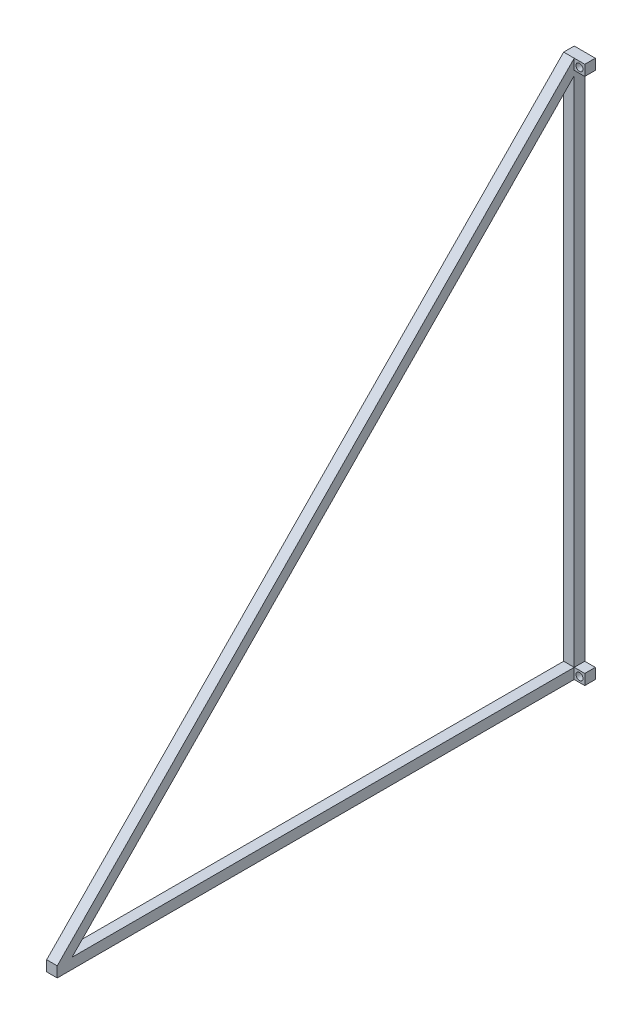
ISO-10303-21;
HEADER;
FILE_DESCRIPTION(('STEP AP214'),'2;1');
FILE_NAME('part.step','',(''),(''),'','','');
FILE_SCHEMA(('AUTOMOTIVE_DESIGN { 1 0 10303 214 1 1 1 1 }'));
ENDSEC;
DATA;
#1=APPLICATION_CONTEXT('core data for automotive mechanical design processes');
#2=APPLICATION_PROTOCOL_DEFINITION('international standard','automotive_design',2000,#1);
#3=PRODUCT_CONTEXT('',#1,'mechanical');
#4=PRODUCT('Part','Part','',(#3));
#5=PRODUCT_RELATED_PRODUCT_CATEGORY('part','',(#4));
#6=PRODUCT_DEFINITION_FORMATION('','',#4);
#7=PRODUCT_DEFINITION_CONTEXT('part definition',#1,'design');
#8=PRODUCT_DEFINITION('design','',#6,#7);
#9=PRODUCT_DEFINITION_SHAPE('','',#8);
#10=(LENGTH_UNIT() NAMED_UNIT(*) SI_UNIT(.MILLI.,.METRE.));
#11=(NAMED_UNIT(*) PLANE_ANGLE_UNIT() SI_UNIT($,.RADIAN.));
#12=(NAMED_UNIT(*) SI_UNIT($,.STERADIAN.) SOLID_ANGLE_UNIT());
#13=UNCERTAINTY_MEASURE_WITH_UNIT(LENGTH_MEASURE(1.E-05),#10,'distance_accuracy_value','');
#14=(GEOMETRIC_REPRESENTATION_CONTEXT(3) GLOBAL_UNCERTAINTY_ASSIGNED_CONTEXT((#13)) GLOBAL_UNIT_ASSIGNED_CONTEXT((#10,
#11,#12)) REPRESENTATION_CONTEXT('',''));
#15=CARTESIAN_POINT('',(0.,0.,0.));
#16=DIRECTION('',(0.,0.,1.));
#17=DIRECTION('',(1.,0.,0.));
#18=AXIS2_PLACEMENT_3D('',#15,#16,#17);
#19=CARTESIAN_POINT('',(0.,0.,3.));
#20=DIRECTION('',(0.,0.,1.));
#21=DIRECTION('',(1.,0.,0.));
#22=AXIS2_PLACEMENT_3D('',#19,#20,#21);
#23=PLANE('',#22);
#24=CARTESIAN_POINT('',(4.49999999999948,151.5,3.));
#25=DIRECTION('',(0.,0.,1.));
#26=DIRECTION('',(1.,0.,0.));
#27=AXIS2_PLACEMENT_3D('',#24,#25,#26);
#28=CIRCLE('',#27,0.999999999999999);
#29=CARTESIAN_POINT('',(5.49999999999948,151.5,3.));
#30=VERTEX_POINT('',#29);
#31=EDGE_CURVE('E200',#30,#30,#28,.T.);
#32=ORIENTED_EDGE('',*,*,#31,.F.);
#33=EDGE_LOOP('',(#32));
#34=FACE_BOUND('',#33,.T.);
#35=DIRECTION('',(1.,0.,0.));
#36=VECTOR('',#35,1.);
#37=CARTESIAN_POINT('',(0.,153.,3.));
#38=LINE('',#37,#36);
#39=CARTESIAN_POINT('',(3.,153.,3.));
#40=VERTEX_POINT('',#39);
#41=CARTESIAN_POINT('',(5.99999999999948,153.,3.));
#42=VERTEX_POINT('',#41);
#43=EDGE_CURVE('E66',#40,#42,#38,.T.);
#44=ORIENTED_EDGE('',*,*,#43,.F.);
#45=DIRECTION('',(0.,-1.,0.));
#46=VECTOR('',#45,1.);
#47=CARTESIAN_POINT('',(3.,0.,3.));
#48=LINE('',#47,#46);
#49=CARTESIAN_POINT('',(3.,150.,3.));
#50=VERTEX_POINT('',#49);
#51=EDGE_CURVE('E11',#40,#50,#48,.T.);
#52=ORIENTED_EDGE('',*,*,#51,.T.);
#53=DIRECTION('',(1.,0.,0.));
#54=VECTOR('',#53,1.);
#55=CARTESIAN_POINT('',(0.,150.,3.));
#56=LINE('',#55,#54);
#57=CARTESIAN_POINT('',(5.99999999999948,150.,3.));
#58=VERTEX_POINT('',#57);
#59=EDGE_CURVE('E149',#50,#58,#56,.T.);
#60=ORIENTED_EDGE('',*,*,#59,.T.);
#61=DIRECTION('',(0.,1.,0.));
#62=VECTOR('',#61,1.);
#63=CARTESIAN_POINT('',(5.99999999999948,0.,3.));
#64=LINE('',#63,#62);
#65=EDGE_CURVE('E156',#58,#42,#64,.T.);
#66=ORIENTED_EDGE('',*,*,#65,.T.);
#67=EDGE_LOOP('',(#44,#52,#60,#66));
#68=FACE_BOUND('',#67,.T.);
#69=ADVANCED_FACE('F41',(#34,#68),#23,.T.);
#70=DIRECTION('',(-1.,0.,0.));
#71=VECTOR('',#70,1.);
#72=CARTESIAN_POINT('',(3.,148.713848418811,2.99999999999999));
#73=LINE('',#72,#71);
#74=CARTESIAN_POINT('',(3.,148.713848418811,2.99999999999999));
#75=VERTEX_POINT('',#74);
#76=CARTESIAN_POINT('',(0.,148.713848418811,2.99999999999999));
#77=VERTEX_POINT('',#76);
#78=EDGE_CURVE('E270',#75,#77,#73,.T.);
#79=ORIENTED_EDGE('',*,*,#78,.T.);
#80=DIRECTION('',(0.,1.,0.));
#81=VECTOR('',#80,1.);
#82=CARTESIAN_POINT('',(0.,0.,3.));
#83=LINE('',#82,#81);
#84=CARTESIAN_POINT('',(0.,3.,3.));
#85=VERTEX_POINT('',#84);
#86=EDGE_CURVE('E291',#85,#77,#83,.T.);
#87=ORIENTED_EDGE('',*,*,#86,.F.);
#88=DIRECTION('',(-1.,0.,0.));
#89=VECTOR('',#88,1.);
#90=CARTESIAN_POINT('',(3.,3.,3.));
#91=LINE('',#90,#89);
#92=CARTESIAN_POINT('',(3.,3.,3.));
#93=VERTEX_POINT('',#92);
#94=EDGE_CURVE('E290',#93,#85,#91,.T.);
#95=ORIENTED_EDGE('',*,*,#94,.F.);
#96=DIRECTION('',(0.,1.,0.));
#97=VECTOR('',#96,1.);
#98=CARTESIAN_POINT('',(3.,0.,3.));
#99=LINE('',#98,#97);
#100=EDGE_CURVE('E145',#93,#75,#99,.T.);
#101=ORIENTED_EDGE('',*,*,#100,.T.);
#102=EDGE_LOOP('',(#79,#87,#95,#101));
#103=FACE_BOUND('',#102,.T.);
#104=ADVANCED_FACE('F289',(#103),#23,.T.);
#105=CARTESIAN_POINT('',(4.5,1.5,3.));
#106=DIRECTION('',(0.,0.,1.));
#107=DIRECTION('',(1.,0.,0.));
#108=AXIS2_PLACEMENT_3D('',#105,#106,#107);
#109=CIRCLE('',#108,1.);
#110=CARTESIAN_POINT('',(5.5,1.5,3.));
#111=VERTEX_POINT('',#110);
#112=EDGE_CURVE('E159',#111,#111,#109,.T.);
#113=ORIENTED_EDGE('',*,*,#112,.F.);
#114=EDGE_LOOP('',(#113));
#115=FACE_BOUND('',#114,.T.);
#116=DIRECTION('',(1.,0.,0.));
#117=VECTOR('',#116,1.);
#118=CARTESIAN_POINT('',(0.,3.,3.));
#119=LINE('',#118,#117);
#120=CARTESIAN_POINT('',(6.,3.,3.));
#121=VERTEX_POINT('',#120);
#122=EDGE_CURVE('E122',#93,#121,#119,.T.);
#123=ORIENTED_EDGE('',*,*,#122,.F.);
#124=DIRECTION('',(0.,1.,0.));
#125=VECTOR('',#124,1.);
#126=CARTESIAN_POINT('',(3.,0.,3.));
#127=LINE('',#126,#125);
#128=CARTESIAN_POINT('',(3.,0.,3.));
#129=VERTEX_POINT('',#128);
#130=EDGE_CURVE('E330',#129,#93,#127,.T.);
#131=ORIENTED_EDGE('',*,*,#130,.F.);
#132=DIRECTION('',(1.,0.,0.));
#133=VECTOR('',#132,1.);
#134=CARTESIAN_POINT('',(0.,0.,3.));
#135=LINE('',#134,#133);
#136=CARTESIAN_POINT('',(6.,0.,3.));
#137=VERTEX_POINT('',#136);
#138=EDGE_CURVE('E124',#129,#137,#135,.T.);
#139=ORIENTED_EDGE('',*,*,#138,.T.);
#140=DIRECTION('',(0.,1.,0.));
#141=VECTOR('',#140,1.);
#142=CARTESIAN_POINT('',(6.,0.,3.));
#143=LINE('',#142,#141);
#144=EDGE_CURVE('E116',#137,#121,#143,.T.);
#145=ORIENTED_EDGE('',*,*,#144,.T.);
#146=EDGE_LOOP('',(#123,#131,#139,#145));
#147=FACE_BOUND('',#146,.T.);
#148=ADVANCED_FACE('F118',(#115,#147),#23,.T.);
#149=CARTESIAN_POINT('',(0.,153.,3.));
#150=DIRECTION('',(0.,1.,0.));
#151=DIRECTION('',(0.,0.,1.));
#152=AXIS2_PLACEMENT_3D('',#149,#150,#151);
#153=PLANE('',#152);
#154=DIRECTION('',(1.,0.,0.));
#155=VECTOR('',#154,1.);
#156=CARTESIAN_POINT('',(0.,153.,0.));
#157=LINE('',#156,#155);
#158=CARTESIAN_POINT('',(0.,153.,0.));
#159=VERTEX_POINT('',#158);
#160=CARTESIAN_POINT('',(5.99999999999948,153.,0.));
#161=VERTEX_POINT('',#160);
#162=EDGE_CURVE('E167',#159,#161,#157,.T.);
#163=ORIENTED_EDGE('',*,*,#162,.F.);
#164=DIRECTION('',(0.,0.,-1.));
#165=VECTOR('',#164,1.);
#166=CARTESIAN_POINT('',(0.,153.,3.));
#167=LINE('',#166,#165);
#168=CARTESIAN_POINT('',(0.,153.,3.));
#169=VERTEX_POINT('',#168);
#170=EDGE_CURVE('E50',#169,#159,#167,.T.);
#171=ORIENTED_EDGE('',*,*,#170,.F.);
#172=EDGE_CURVE('E106',#169,#40,#38,.T.);
#173=ORIENTED_EDGE('',*,*,#172,.T.);
#174=ORIENTED_EDGE('',*,*,#43,.T.);
#175=DIRECTION('',(0.,0.,-1.));
#176=VECTOR('',#175,1.);
#177=CARTESIAN_POINT('',(5.99999999999948,153.,3.));
#178=LINE('',#177,#176);
#179=EDGE_CURVE('E98',#42,#161,#178,.T.);
#180=ORIENTED_EDGE('',*,*,#179,.T.);
#181=EDGE_LOOP('',(#163,#171,#173,#174,#180));
#182=FACE_BOUND('',#181,.T.);
#183=ADVANCED_FACE('F225',(#182),#153,.T.);
#184=CARTESIAN_POINT('',(0.,0.,3.));
#185=DIRECTION('',(-1.,0.,0.));
#186=DIRECTION('',(0.,-1.,0.));
#187=AXIS2_PLACEMENT_3D('',#184,#185,#186);
#188=PLANE('',#187);
#189=DIRECTION('',(0.,-0.714212839142507,0.699928582359657));
#190=VECTOR('',#189,1.);
#191=CARTESIAN_POINT('',(0.,76.4543970618241,78.0146908794124));
#192=LINE('',#191,#190);
#193=CARTESIAN_POINT('',(0.,2.99999999999999,150.));
#194=VERTEX_POINT('',#193);
#195=EDGE_CURVE('E224',#169,#194,#192,.T.);
#196=ORIENTED_EDGE('',*,*,#195,.F.);
#197=ORIENTED_EDGE('',*,*,#170,.T.);
#198=DIRECTION('',(0.,1.,0.));
#199=VECTOR('',#198,1.);
#200=CARTESIAN_POINT('',(0.,0.,0.));
#201=LINE('',#200,#199);
#202=CARTESIAN_POINT('',(0.,0.,0.));
#203=VERTEX_POINT('',#202);
#204=EDGE_CURVE('E172',#203,#159,#201,.T.);
#205=ORIENTED_EDGE('',*,*,#204,.F.);
#206=DIRECTION('',(0.,0.,-1.));
#207=VECTOR('',#206,1.);
#208=CARTESIAN_POINT('',(0.,0.,3.));
#209=LINE('',#208,#207);
#210=CARTESIAN_POINT('',(0.,0.,150.));
#211=VERTEX_POINT('',#210);
#212=EDGE_CURVE('E215',#211,#203,#209,.T.);
#213=ORIENTED_EDGE('',*,*,#212,.F.);
#214=DIRECTION('',(0.,1.,0.));
#215=VECTOR('',#214,1.);
#216=CARTESIAN_POINT('',(0.,1.38777878078145E-12,150.));
#217=LINE('',#216,#215);
#218=EDGE_CURVE('E239',#211,#194,#217,.T.);
#219=ORIENTED_EDGE('',*,*,#218,.T.);
#220=EDGE_LOOP('',(#196,#197,#205,#213,#219));
#221=FACE_BOUND('',#220,.T.);
#222=ORIENTED_EDGE('',*,*,#86,.T.);
#223=DIRECTION('',(0.,-0.714212839142507,0.699928582359657));
#224=VECTOR('',#223,1.);
#225=CARTESIAN_POINT('',(0.,74.3546113147451,75.8720523619849));
#226=LINE('',#225,#224);
#227=CARTESIAN_POINT('',(0.,3.,145.799571450435));
#228=VERTEX_POINT('',#227);
#229=EDGE_CURVE('E274',#77,#228,#226,.T.);
#230=ORIENTED_EDGE('',*,*,#229,.T.);
#231=DIRECTION('',(0.,0.,1.));
#232=VECTOR('',#231,1.);
#233=CARTESIAN_POINT('',(0.,3.,0.));
#234=LINE('',#233,#232);
#235=EDGE_CURVE('E57',#85,#228,#234,.T.);
#236=ORIENTED_EDGE('',*,*,#235,.F.);
#237=EDGE_LOOP('',(#222,#230,#236));
#238=FACE_BOUND('',#237,.T.);
#239=ADVANCED_FACE('F221',(#221,#238),#188,.T.);
#240=CARTESIAN_POINT('',(0.,0.,3.));
#241=DIRECTION('',(0.,1.,0.));
#242=DIRECTION('',(0.,0.,1.));
#243=AXIS2_PLACEMENT_3D('',#240,#241,#242);
#244=PLANE('',#243);
#245=DIRECTION('',(1.,0.,0.));
#246=VECTOR('',#245,1.);
#247=CARTESIAN_POINT('',(0.,0.,0.));
#248=LINE('',#247,#246);
#249=CARTESIAN_POINT('',(6.,0.,0.));
#250=VERTEX_POINT('',#249);
#251=EDGE_CURVE('E176',#203,#250,#248,.T.);
#252=ORIENTED_EDGE('',*,*,#251,.T.);
#253=DIRECTION('',(0.,0.,-1.));
#254=VECTOR('',#253,1.);
#255=CARTESIAN_POINT('',(6.,0.,3.));
#256=LINE('',#255,#254);
#257=EDGE_CURVE('E138',#137,#250,#256,.T.);
#258=ORIENTED_EDGE('',*,*,#257,.F.);
#259=ORIENTED_EDGE('',*,*,#138,.F.);
#260=DIRECTION('',(0.,0.,1.));
#261=VECTOR('',#260,1.);
#262=CARTESIAN_POINT('',(3.,0.,0.));
#263=LINE('',#262,#261);
#264=CARTESIAN_POINT('',(3.,0.,150.));
#265=VERTEX_POINT('',#264);
#266=EDGE_CURVE('E327',#129,#265,#263,.T.);
#267=ORIENTED_EDGE('',*,*,#266,.T.);
#268=DIRECTION('',(-1.,0.,0.));
#269=VECTOR('',#268,1.);
#270=CARTESIAN_POINT('',(3.,0.,150.));
#271=LINE('',#270,#269);
#272=EDGE_CURVE('E236',#265,#211,#271,.T.);
#273=ORIENTED_EDGE('',*,*,#272,.T.);
#274=ORIENTED_EDGE('',*,*,#212,.T.);
#275=EDGE_LOOP('',(#252,#258,#259,#267,#273,#274));
#276=FACE_BOUND('',#275,.T.);
#277=ADVANCED_FACE('F231',(#276),#244,.F.);
#278=CARTESIAN_POINT('',(6.,0.,3.));
#279=DIRECTION('',(-1.,0.,0.));
#280=DIRECTION('',(0.,0.,1.));
#281=AXIS2_PLACEMENT_3D('',#278,#279,#280);
#282=PLANE('',#281);
#283=DIRECTION('',(0.,1.,0.));
#284=VECTOR('',#283,1.);
#285=CARTESIAN_POINT('',(6.,0.,0.));
#286=LINE('',#285,#284);
#287=CARTESIAN_POINT('',(6.,3.,0.));
#288=VERTEX_POINT('',#287);
#289=EDGE_CURVE('E133',#250,#288,#286,.T.);
#290=ORIENTED_EDGE('',*,*,#289,.T.);
#291=DIRECTION('',(0.,0.,-1.));
#292=VECTOR('',#291,1.);
#293=CARTESIAN_POINT('',(6.,3.,3.));
#294=LINE('',#293,#292);
#295=EDGE_CURVE('E131',#121,#288,#294,.T.);
#296=ORIENTED_EDGE('',*,*,#295,.F.);
#297=ORIENTED_EDGE('',*,*,#144,.F.);
#298=ORIENTED_EDGE('',*,*,#257,.T.);
#299=EDGE_LOOP('',(#290,#296,#297,#298));
#300=FACE_BOUND('',#299,.T.);
#301=ADVANCED_FACE('F132',(#300),#282,.F.);
#302=CARTESIAN_POINT('',(0.,3.,3.));
#303=DIRECTION('',(0.,1.,0.));
#304=DIRECTION('',(0.,0.,1.));
#305=AXIS2_PLACEMENT_3D('',#302,#303,#304);
#306=PLANE('',#305);
#307=DIRECTION('',(1.,0.,0.));
#308=VECTOR('',#307,1.);
#309=CARTESIAN_POINT('',(0.,3.,0.));
#310=LINE('',#309,#308);
#311=CARTESIAN_POINT('',(3.,3.,0.));
#312=VERTEX_POINT('',#311);
#313=EDGE_CURVE('E182',#312,#288,#310,.T.);
#314=ORIENTED_EDGE('',*,*,#313,.F.);
#315=DIRECTION('',(0.,0.,-1.));
#316=VECTOR('',#315,1.);
#317=CARTESIAN_POINT('',(3.,3.,3.));
#318=LINE('',#317,#316);
#319=EDGE_CURVE('E139',#93,#312,#318,.T.);
#320=ORIENTED_EDGE('',*,*,#319,.F.);
#321=ORIENTED_EDGE('',*,*,#122,.T.);
#322=ORIENTED_EDGE('',*,*,#295,.T.);
#323=EDGE_LOOP('',(#314,#320,#321,#322));
#324=FACE_BOUND('',#323,.T.);
#325=ADVANCED_FACE('F142',(#324),#306,.T.);
#326=CARTESIAN_POINT('',(3.,0.,3.));
#327=DIRECTION('',(-1.,0.,0.));
#328=DIRECTION('',(0.,-1.,0.));
#329=AXIS2_PLACEMENT_3D('',#326,#327,#328);
#330=PLANE('',#329);
#331=DIRECTION('',(0.,1.,0.));
#332=VECTOR('',#331,1.);
#333=CARTESIAN_POINT('',(3.,0.,0.));
#334=LINE('',#333,#332);
#335=CARTESIAN_POINT('',(2.99999999999948,150.,0.));
#336=VERTEX_POINT('',#335);
#337=EDGE_CURVE('E185',#312,#336,#334,.T.);
#338=ORIENTED_EDGE('',*,*,#337,.T.);
#339=DIRECTION('',(0.,0.,-1.));
#340=VECTOR('',#339,1.);
#341=CARTESIAN_POINT('',(2.99999999999948,150.,3.));
#342=LINE('',#341,#340);
#343=EDGE_CURVE('E207',#50,#336,#342,.T.);
#344=ORIENTED_EDGE('',*,*,#343,.F.);
#345=ORIENTED_EDGE('',*,*,#51,.F.);
#346=DIRECTION('',(0.,-0.714212839142507,0.699928582359657));
#347=VECTOR('',#346,1.);
#348=CARTESIAN_POINT('',(3.,76.4543970618241,78.0146908794124));
#349=LINE('',#348,#347);
#350=CARTESIAN_POINT('',(3.,2.99999999999999,150.));
#351=VERTEX_POINT('',#350);
#352=EDGE_CURVE('E279',#40,#351,#349,.T.);
#353=ORIENTED_EDGE('',*,*,#352,.T.);
#354=DIRECTION('',(0.,1.,0.));
#355=VECTOR('',#354,1.);
#356=CARTESIAN_POINT('',(3.,1.38776393851631E-12,150.));
#357=LINE('',#356,#355);
#358=EDGE_CURVE('E324',#265,#351,#357,.T.);
#359=ORIENTED_EDGE('',*,*,#358,.F.);
#360=ORIENTED_EDGE('',*,*,#266,.F.);
#361=ORIENTED_EDGE('',*,*,#130,.T.);
#362=DIRECTION('',(0.,0.,1.));
#363=VECTOR('',#362,1.);
#364=CARTESIAN_POINT('',(3.,3.,0.));
#365=LINE('',#364,#363);
#366=CARTESIAN_POINT('',(3.,3.,145.799571450435));
#367=VERTEX_POINT('',#366);
#368=EDGE_CURVE('E284',#93,#367,#365,.T.);
#369=ORIENTED_EDGE('',*,*,#368,.T.);
#370=DIRECTION('',(0.,-0.714212839142507,0.699928582359657));
#371=VECTOR('',#370,1.);
#372=CARTESIAN_POINT('',(3.,74.3546113147451,75.8720523619849));
#373=LINE('',#372,#371);
#374=EDGE_CURVE('E273',#75,#367,#373,.T.);
#375=ORIENTED_EDGE('',*,*,#374,.F.);
#376=ORIENTED_EDGE('',*,*,#100,.F.);
#377=ORIENTED_EDGE('',*,*,#319,.T.);
#378=EDGE_LOOP('',(#338,#344,#345,#353,#359,#360,#361,#369,#375,#376,#377));
#379=FACE_BOUND('',#378,.T.);
#380=ADVANCED_FACE('F282',(#379),#330,.F.);
#381=CARTESIAN_POINT('',(0.,150.,3.));
#382=DIRECTION('',(0.,1.,0.));
#383=DIRECTION('',(0.,0.,1.));
#384=AXIS2_PLACEMENT_3D('',#381,#382,#383);
#385=PLANE('',#384);
#386=DIRECTION('',(1.,0.,0.));
#387=VECTOR('',#386,1.);
#388=CARTESIAN_POINT('',(0.,150.,0.));
#389=LINE('',#388,#387);
#390=CARTESIAN_POINT('',(5.99999999999948,150.,0.));
#391=VERTEX_POINT('',#390);
#392=EDGE_CURVE('E189',#336,#391,#389,.T.);
#393=ORIENTED_EDGE('',*,*,#392,.T.);
#394=DIRECTION('',(0.,0.,-1.));
#395=VECTOR('',#394,1.);
#396=CARTESIAN_POINT('',(5.99999999999948,150.,3.));
#397=LINE('',#396,#395);
#398=EDGE_CURVE('E203',#58,#391,#397,.T.);
#399=ORIENTED_EDGE('',*,*,#398,.F.);
#400=ORIENTED_EDGE('',*,*,#59,.F.);
#401=ORIENTED_EDGE('',*,*,#343,.T.);
#402=EDGE_LOOP('',(#393,#399,#400,#401));
#403=FACE_BOUND('',#402,.T.);
#404=ADVANCED_FACE('F376',(#403),#385,.F.);
#405=CARTESIAN_POINT('',(5.99999999999948,0.,3.));
#406=DIRECTION('',(-1.,0.,0.));
#407=DIRECTION('',(0.,0.,1.));
#408=AXIS2_PLACEMENT_3D('',#405,#406,#407);
#409=PLANE('',#408);
#410=DIRECTION('',(0.,1.,0.));
#411=VECTOR('',#410,1.);
#412=CARTESIAN_POINT('',(5.99999999999948,0.,0.));
#413=LINE('',#412,#411);
#414=EDGE_CURVE('E193',#391,#161,#413,.T.);
#415=ORIENTED_EDGE('',*,*,#414,.T.);
#416=ORIENTED_EDGE('',*,*,#179,.F.);
#417=ORIENTED_EDGE('',*,*,#65,.F.);
#418=ORIENTED_EDGE('',*,*,#398,.T.);
#419=EDGE_LOOP('',(#415,#416,#417,#418));
#420=FACE_BOUND('',#419,.T.);
#421=ADVANCED_FACE('F373',(#420),#409,.F.);
#422=CARTESIAN_POINT('',(4.49999999999948,151.5,3.));
#423=DIRECTION('',(0.,0.,-1.));
#424=DIRECTION('',(-1.,0.,0.));
#425=AXIS2_PLACEMENT_3D('',#422,#423,#424);
#426=CYLINDRICAL_SURFACE('',#425,0.999999999999999);
#427=ORIENTED_EDGE('',*,*,#31,.T.);
#428=EDGE_LOOP('',(#427));
#429=FACE_BOUND('',#428,.T.);
#430=CARTESIAN_POINT('',(4.49999999999948,151.5,0.));
#431=DIRECTION('',(0.,0.,1.));
#432=DIRECTION('',(1.,0.,0.));
#433=AXIS2_PLACEMENT_3D('',#430,#431,#432);
#434=CIRCLE('',#433,0.999999999999999);
#435=CARTESIAN_POINT('',(5.49999999999948,151.5,0.));
#436=VERTEX_POINT('',#435);
#437=EDGE_CURVE('E163',#436,#436,#434,.T.);
#438=ORIENTED_EDGE('',*,*,#437,.F.);
#439=EDGE_LOOP('',(#438));
#440=FACE_BOUND('',#439,.T.);
#441=ADVANCED_FACE('F43',(#429,#440),#426,.F.);
#442=CARTESIAN_POINT('',(4.5,1.5,3.));
#443=DIRECTION('',(0.,0.,-1.));
#444=DIRECTION('',(-1.,0.,0.));
#445=AXIS2_PLACEMENT_3D('',#442,#443,#444);
#446=CYLINDRICAL_SURFACE('',#445,1.);
#447=ORIENTED_EDGE('',*,*,#112,.T.);
#448=EDGE_LOOP('',(#447));
#449=FACE_BOUND('',#448,.T.);
#450=CARTESIAN_POINT('',(4.5,1.5,0.));
#451=DIRECTION('',(0.,0.,1.));
#452=DIRECTION('',(1.,0.,0.));
#453=AXIS2_PLACEMENT_3D('',#450,#451,#452);
#454=CIRCLE('',#453,1.);
#455=CARTESIAN_POINT('',(5.5,1.5,0.));
#456=VERTEX_POINT('',#455);
#457=EDGE_CURVE('E196',#456,#456,#454,.T.);
#458=ORIENTED_EDGE('',*,*,#457,.F.);
#459=EDGE_LOOP('',(#458));
#460=FACE_BOUND('',#459,.T.);
#461=ADVANCED_FACE('F359',(#449,#460),#446,.F.);
#462=CARTESIAN_POINT('',(0.,0.,0.));
#463=DIRECTION('',(0.,0.,1.));
#464=DIRECTION('',(1.,0.,0.));
#465=AXIS2_PLACEMENT_3D('',#462,#463,#464);
#466=PLANE('',#465);
#467=ORIENTED_EDGE('',*,*,#437,.T.);
#468=EDGE_LOOP('',(#467));
#469=FACE_BOUND('',#468,.T.);
#470=ORIENTED_EDGE('',*,*,#162,.T.);
#471=ORIENTED_EDGE('',*,*,#414,.F.);
#472=ORIENTED_EDGE('',*,*,#392,.F.);
#473=ORIENTED_EDGE('',*,*,#337,.F.);
#474=ORIENTED_EDGE('',*,*,#313,.T.);
#475=ORIENTED_EDGE('',*,*,#289,.F.);
#476=ORIENTED_EDGE('',*,*,#251,.F.);
#477=ORIENTED_EDGE('',*,*,#204,.T.);
#478=EDGE_LOOP('',(#470,#471,#472,#473,#474,#475,#476,#477));
#479=FACE_BOUND('',#478,.T.);
#480=ORIENTED_EDGE('',*,*,#457,.T.);
#481=EDGE_LOOP('',(#480));
#482=FACE_BOUND('',#481,.T.);
#483=ADVANCED_FACE('F228',(#469,#479,#482),#466,.F.);
#484=CARTESIAN_POINT('',(3.,76.4543970618241,78.0146908794124));
#485=DIRECTION('',(0.,-0.699928582359657,-0.714212839142507));
#486=DIRECTION('',(0.,0.714212839142507,-0.699928582359657));
#487=AXIS2_PLACEMENT_3D('',#484,#485,#486);
#488=PLANE('',#487);
#489=ORIENTED_EDGE('',*,*,#195,.T.);
#490=DIRECTION('',(-1.,0.,0.));
#491=VECTOR('',#490,1.);
#492=CARTESIAN_POINT('',(3.,2.99999999999999,150.));
#493=LINE('',#492,#491);
#494=EDGE_CURVE('E168',#351,#194,#493,.T.);
#495=ORIENTED_EDGE('',*,*,#494,.F.);
#496=ORIENTED_EDGE('',*,*,#352,.F.);
#497=ORIENTED_EDGE('',*,*,#172,.F.);
#498=EDGE_LOOP('',(#489,#495,#496,#497));
#499=FACE_BOUND('',#498,.T.);
#500=ADVANCED_FACE('F365',(#499),#488,.F.);
#501=CARTESIAN_POINT('',(3.,1.38776393851631E-12,150.));
#502=DIRECTION('',(0.,0.,1.));
#503=DIRECTION('',(0.,-1.,0.));
#504=AXIS2_PLACEMENT_3D('',#501,#502,#503);
#505=PLANE('',#504);
#506=ORIENTED_EDGE('',*,*,#218,.F.);
#507=ORIENTED_EDGE('',*,*,#272,.F.);
#508=ORIENTED_EDGE('',*,*,#358,.T.);
#509=ORIENTED_EDGE('',*,*,#494,.T.);
#510=EDGE_LOOP('',(#506,#507,#508,#509));
#511=FACE_BOUND('',#510,.T.);
#512=ADVANCED_FACE('F370',(#511),#505,.T.);
#513=CARTESIAN_POINT('',(3.,3.,0.));
#514=DIRECTION('',(0.,-1.,0.));
#515=DIRECTION('',(1.,0.,0.));
#516=AXIS2_PLACEMENT_3D('',#513,#514,#515);
#517=PLANE('',#516);
#518=ORIENTED_EDGE('',*,*,#235,.T.);
#519=DIRECTION('',(-1.,0.,0.));
#520=VECTOR('',#519,1.);
#521=CARTESIAN_POINT('',(3.,3.,145.799571450435));
#522=LINE('',#521,#520);
#523=EDGE_CURVE('E278',#367,#228,#522,.T.);
#524=ORIENTED_EDGE('',*,*,#523,.F.);
#525=ORIENTED_EDGE('',*,*,#368,.F.);
#526=ORIENTED_EDGE('',*,*,#94,.T.);
#527=EDGE_LOOP('',(#518,#524,#525,#526));
#528=FACE_BOUND('',#527,.T.);
#529=ADVANCED_FACE('F335',(#528),#517,.F.);
#530=CARTESIAN_POINT('',(3.,74.3546113147451,75.8720523619849));
#531=DIRECTION('',(0.,-0.699928582359657,-0.714212839142507));
#532=DIRECTION('',(0.,0.714212839142507,-0.699928582359657));
#533=AXIS2_PLACEMENT_3D('',#530,#531,#532);
#534=PLANE('',#533);
#535=ORIENTED_EDGE('',*,*,#229,.F.);
#536=ORIENTED_EDGE('',*,*,#78,.F.);
#537=ORIENTED_EDGE('',*,*,#374,.T.);
#538=ORIENTED_EDGE('',*,*,#523,.T.);
#539=EDGE_LOOP('',(#535,#536,#537,#538));
#540=FACE_BOUND('',#539,.T.);
#541=ADVANCED_FACE('F272',(#540),#534,.T.);
#542=CLOSED_SHELL('',(#69,#104,#148,#183,#239,#277,#301,#325,#380,#404,#421,#441,#461,#483,#500,
#512,#529,#541));
#543=MANIFOLD_SOLID_BREP('B2',#542);
#544=ADVANCED_BREP_SHAPE_REPRESENTATION('',(#18,#543),#14);
#545=SHAPE_DEFINITION_REPRESENTATION(#9,#544);
ENDSEC;
END-ISO-10303-21;
